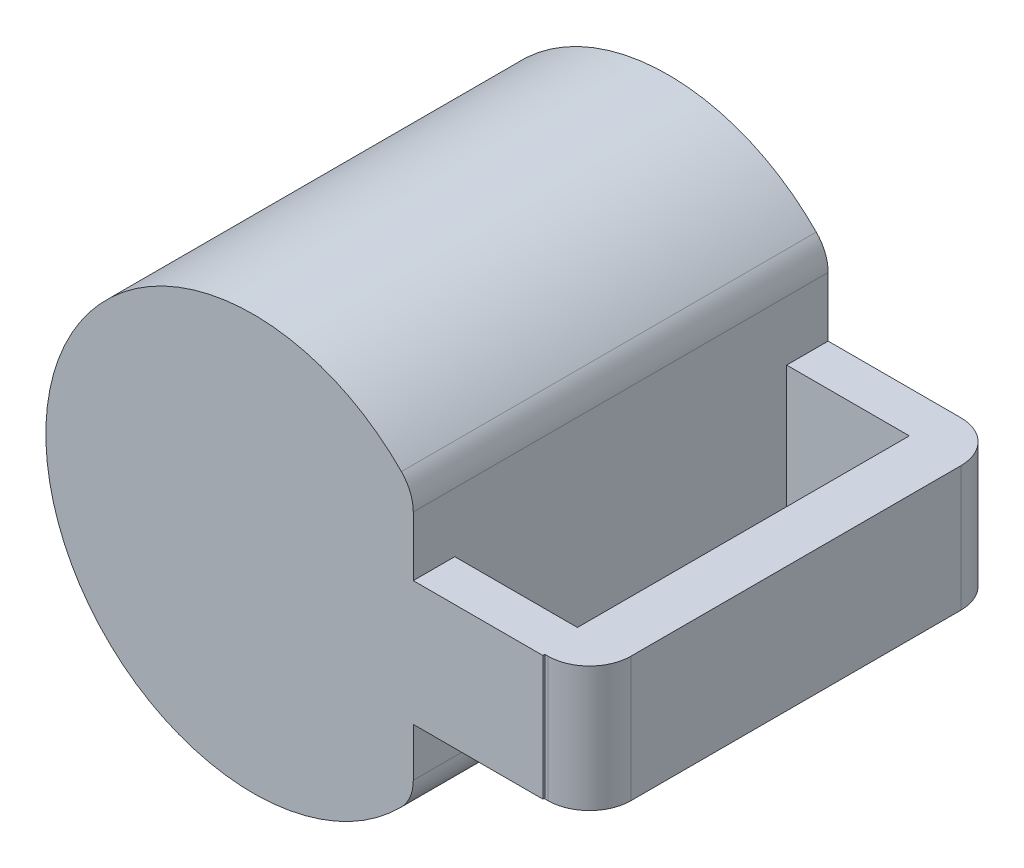
ISO-10303-21;
HEADER;
FILE_DESCRIPTION(('STEP AP214'),'2;1');
FILE_NAME('part.step','',(''),(''),'','','');
FILE_SCHEMA(('AUTOMOTIVE_DESIGN { 1 0 10303 214 1 1 1 1 }'));
ENDSEC;
DATA;
#1=APPLICATION_CONTEXT('core data for automotive mechanical design processes');
#2=APPLICATION_PROTOCOL_DEFINITION('international standard','automotive_design',2000,#1);
#3=PRODUCT_CONTEXT('',#1,'mechanical');
#4=PRODUCT('Part','Part','',(#3));
#5=PRODUCT_RELATED_PRODUCT_CATEGORY('part','',(#4));
#6=PRODUCT_DEFINITION_FORMATION('','',#4);
#7=PRODUCT_DEFINITION_CONTEXT('part definition',#1,'design');
#8=PRODUCT_DEFINITION('design','',#6,#7);
#9=PRODUCT_DEFINITION_SHAPE('','',#8);
#10=(LENGTH_UNIT() NAMED_UNIT(*) SI_UNIT(.MILLI.,.METRE.));
#11=(NAMED_UNIT(*) PLANE_ANGLE_UNIT() SI_UNIT($,.RADIAN.));
#12=(NAMED_UNIT(*) SI_UNIT($,.STERADIAN.) SOLID_ANGLE_UNIT());
#13=UNCERTAINTY_MEASURE_WITH_UNIT(LENGTH_MEASURE(1.E-05),#10,'distance_accuracy_value','');
#14=(GEOMETRIC_REPRESENTATION_CONTEXT(3) GLOBAL_UNCERTAINTY_ASSIGNED_CONTEXT((#13)) GLOBAL_UNIT_ASSIGNED_CONTEXT((#10,
#11,#12)) REPRESENTATION_CONTEXT('',''));
#15=CARTESIAN_POINT('',(0.,0.,0.));
#16=DIRECTION('',(0.,0.,1.));
#17=DIRECTION('',(1.,0.,0.));
#18=AXIS2_PLACEMENT_3D('',#15,#16,#17);
#19=CARTESIAN_POINT('',(-71.355365605137,5.73254638357682,10.));
#20=DIRECTION('',(-1.,0.,0.));
#21=DIRECTION('',(0.,0.,1.));
#22=AXIS2_PLACEMENT_3D('',#19,#20,#21);
#23=PLANE('',#22);
#24=DIRECTION('',(0.,1.,0.));
#25=VECTOR('',#24,1.);
#26=CARTESIAN_POINT('',(-71.355365605137,5.73254638357682,10.));
#27=LINE('',#26,#25);
#28=CARTESIAN_POINT('',(-71.355365605137,-0.250230693947041,10.));
#29=VERTEX_POINT('',#28);
#30=CARTESIAN_POINT('',(-71.355365605137,0.917510407191457,10.));
#31=VERTEX_POINT('',#30);
#32=EDGE_CURVE('E243',#29,#31,#27,.T.);
#33=ORIENTED_EDGE('',*,*,#32,.F.);
#34=DIRECTION('',(0.,0.,-1.));
#35=VECTOR('',#34,1.);
#36=CARTESIAN_POINT('',(-71.355365605137,-0.250230693947043,10.));
#37=LINE('',#36,#35);
#38=CARTESIAN_POINT('',(-71.355365605137,-0.250230693947041,0.));
#39=VERTEX_POINT('',#38);
#40=EDGE_CURVE('E284',#29,#39,#37,.T.);
#41=ORIENTED_EDGE('',*,*,#40,.T.);
#42=DIRECTION('',(0.,1.,0.));
#43=VECTOR('',#42,1.);
#44=CARTESIAN_POINT('',(-71.355365605137,5.73254638357682,0.));
#45=LINE('',#44,#43);
#46=CARTESIAN_POINT('',(-71.355365605137,0.917510407191457,0.));
#47=VERTEX_POINT('',#46);
#48=EDGE_CURVE('E247',#39,#47,#45,.T.);
#49=ORIENTED_EDGE('',*,*,#48,.T.);
#50=DIRECTION('',(0.,0.,-1.));
#51=VECTOR('',#50,1.);
#52=CARTESIAN_POINT('',(-71.355365605137,0.917510407191457,0.));
#53=LINE('',#52,#51);
#54=CARTESIAN_POINT('',(-71.355365605137,0.917510407191458,0.999999999999999));
#55=VERTEX_POINT('',#54);
#56=EDGE_CURVE('E204',#55,#47,#53,.T.);
#57=ORIENTED_EDGE('',*,*,#56,.F.);
#58=DIRECTION('',(0.,-1.,0.));
#59=VECTOR('',#58,1.);
#60=CARTESIAN_POINT('',(-71.355365605137,3.91751040719146,1.));
#61=LINE('',#60,#59);
#62=CARTESIAN_POINT('',(-71.355365605137,3.91751040719146,0.999999999999999));
#63=VERTEX_POINT('',#62);
#64=EDGE_CURVE('E201',#63,#55,#61,.T.);
#65=ORIENTED_EDGE('',*,*,#64,.F.);
#66=DIRECTION('',(0.,0.,1.));
#67=VECTOR('',#66,1.);
#68=CARTESIAN_POINT('',(-71.355365605137,3.91751040719146,0.));
#69=LINE('',#68,#67);
#70=CARTESIAN_POINT('',(-71.355365605137,3.91751040719146,0.));
#71=VERTEX_POINT('',#70);
#72=EDGE_CURVE('E198',#71,#63,#69,.T.);
#73=ORIENTED_EDGE('',*,*,#72,.F.);
#74=CARTESIAN_POINT('',(-71.355365605137,5.35023069394706,0.));
#75=VERTEX_POINT('',#74);
#76=EDGE_CURVE('E236',#71,#75,#45,.T.);
#77=ORIENTED_EDGE('',*,*,#76,.T.);
#78=DIRECTION('',(0.,0.,-1.));
#79=VECTOR('',#78,1.);
#80=CARTESIAN_POINT('',(-71.355365605137,5.35023069394706,10.));
#81=LINE('',#80,#79);
#82=CARTESIAN_POINT('',(-71.355365605137,5.35023069394706,10.));
#83=VERTEX_POINT('',#82);
#84=EDGE_CURVE('E280',#75,#83,#81,.F.);
#85=ORIENTED_EDGE('',*,*,#84,.T.);
#86=CARTESIAN_POINT('',(-71.355365605137,3.91751040719146,10.));
#87=VERTEX_POINT('',#86);
#88=EDGE_CURVE('E246',#87,#83,#27,.T.);
#89=ORIENTED_EDGE('',*,*,#88,.F.);
#90=DIRECTION('',(0.,0.,-1.));
#91=VECTOR('',#90,1.);
#92=CARTESIAN_POINT('',(-71.355365605137,3.91751040719146,10.));
#93=LINE('',#92,#91);
#94=CARTESIAN_POINT('',(-71.355365605137,3.91751040719146,9.));
#95=VERTEX_POINT('',#94);
#96=EDGE_CURVE('E216',#87,#95,#93,.T.);
#97=ORIENTED_EDGE('',*,*,#96,.T.);
#98=DIRECTION('',(0.,-1.,0.));
#99=VECTOR('',#98,1.);
#100=CARTESIAN_POINT('',(-71.355365605137,3.91751040719146,9.));
#101=LINE('',#100,#99);
#102=CARTESIAN_POINT('',(-71.355365605137,0.917510407191457,9.));
#103=VERTEX_POINT('',#102);
#104=EDGE_CURVE('E229',#95,#103,#101,.T.);
#105=ORIENTED_EDGE('',*,*,#104,.T.);
#106=DIRECTION('',(0.,0.,-1.));
#107=VECTOR('',#106,1.);
#108=CARTESIAN_POINT('',(-71.355365605137,0.917510407191457,10.));
#109=LINE('',#108,#107);
#110=EDGE_CURVE('E221',#31,#103,#109,.T.);
#111=ORIENTED_EDGE('',*,*,#110,.F.);
#112=EDGE_LOOP('',(#33,#41,#49,#57,#65,#73,#77,#85,#89,#97,#105,#111));
#113=FACE_BOUND('',#112,.T.);
#114=ADVANCED_FACE('F33',(#113),#23,.F.);
#115=CARTESIAN_POINT('',(-75.2117108329897,2.55000000000001,0.));
#116=DIRECTION('',(0.,0.,1.));
#117=DIRECTION('',(1.,0.,0.));
#118=AXIS2_PLACEMENT_3D('',#115,#116,#117);
#119=PLANE('',#118);
#120=ORIENTED_EDGE('',*,*,#48,.F.);
#121=CARTESIAN_POINT('',(-72.355365605137,-0.250230693947042,0.));
#122=DIRECTION('',(0.,0.,1.));
#123=DIRECTION('',(1.,0.,0.));
#124=AXIS2_PLACEMENT_3D('',#121,#122,#123);
#125=CIRCLE('',#124,1.);
#126=CARTESIAN_POINT('',(-71.6412792981738,-0.95028836743381,0.));
#127=VERTEX_POINT('',#126);
#128=EDGE_CURVE('E55',#39,#127,#125,.F.);
#129=ORIENTED_EDGE('',*,*,#128,.T.);
#130=CARTESIAN_POINT('',(-75.2117108329897,2.55000000000001,0.));
#131=DIRECTION('',(0.,0.,1.));
#132=DIRECTION('',(1.,0.,0.));
#133=AXIS2_PLACEMENT_3D('',#130,#131,#132);
#134=CIRCLE('',#133,5.);
#135=CARTESIAN_POINT('',(-71.6412792981738,6.05028836743383,0.));
#136=VERTEX_POINT('',#135);
#137=EDGE_CURVE('E245',#136,#127,#134,.T.);
#138=ORIENTED_EDGE('',*,*,#137,.F.);
#139=CARTESIAN_POINT('',(-72.355365605137,5.35023069394706,0.));
#140=DIRECTION('',(0.,0.,1.));
#141=DIRECTION('',(1.,0.,0.));
#142=AXIS2_PLACEMENT_3D('',#139,#140,#141);
#143=CIRCLE('',#142,1.);
#144=EDGE_CURVE('E278',#136,#75,#143,.F.);
#145=ORIENTED_EDGE('',*,*,#144,.T.);
#146=ORIENTED_EDGE('',*,*,#76,.F.);
#147=DIRECTION('',(-1.,0.,0.));
#148=VECTOR('',#147,1.);
#149=CARTESIAN_POINT('',(-67.355365605137,3.91751040719146,0.));
#150=LINE('',#149,#148);
#151=CARTESIAN_POINT('',(-68.155365605137,3.91751040719146,0.));
#152=VERTEX_POINT('',#151);
#153=EDGE_CURVE('E214',#152,#71,#150,.T.);
#154=ORIENTED_EDGE('',*,*,#153,.F.);
#155=DIRECTION('',(0.,1.,0.));
#156=VECTOR('',#155,1.);
#157=CARTESIAN_POINT('',(-68.155365605137,2.55000000000001,0.));
#158=LINE('',#157,#156);
#159=CARTESIAN_POINT('',(-68.155365605137,0.900046076850458,0.));
#160=VERTEX_POINT('',#159);
#161=EDGE_CURVE('E262',#152,#160,#158,.F.);
#162=ORIENTED_EDGE('',*,*,#161,.T.);
#163=DIRECTION('',(1.,0.,0.));
#164=VECTOR('',#163,1.);
#165=CARTESIAN_POINT('',(-68.3989979917468,0.900046076850458,0.));
#166=LINE('',#165,#164);
#167=CARTESIAN_POINT('',(-68.3989979917468,0.900046076850458,0.));
#168=VERTEX_POINT('',#167);
#169=EDGE_CURVE('E177',#168,#160,#166,.T.);
#170=ORIENTED_EDGE('',*,*,#169,.F.);
#171=DIRECTION('',(0.,1.,0.));
#172=VECTOR('',#171,1.);
#173=CARTESIAN_POINT('',(-68.3989979917468,3.91751040719146,0.));
#174=LINE('',#173,#172);
#175=CARTESIAN_POINT('',(-68.3989979917468,0.917510407191457,0.));
#176=VERTEX_POINT('',#175);
#177=EDGE_CURVE('E184',#168,#176,#174,.T.);
#178=ORIENTED_EDGE('',*,*,#177,.T.);
#179=DIRECTION('',(-1.,0.,0.));
#180=VECTOR('',#179,1.);
#181=CARTESIAN_POINT('',(-67.355365605137,0.917510407191457,0.));
#182=LINE('',#181,#180);
#183=EDGE_CURVE('E207',#176,#47,#182,.T.);
#184=ORIENTED_EDGE('',*,*,#183,.T.);
#185=EDGE_LOOP('',(#120,#129,#138,#145,#146,#154,#162,#170,#178,#184));
#186=FACE_BOUND('',#185,.T.);
#187=ADVANCED_FACE('F294',(#186),#119,.F.);
#188=CARTESIAN_POINT('',(-75.2117108329897,2.55000000000001,10.));
#189=DIRECTION('',(0.,0.,1.));
#190=DIRECTION('',(1.,0.,0.));
#191=AXIS2_PLACEMENT_3D('',#188,#189,#190);
#192=PLANE('',#191);
#193=CARTESIAN_POINT('',(-75.2117108329897,2.55000000000001,10.));
#194=DIRECTION('',(0.,0.,1.));
#195=DIRECTION('',(1.,0.,0.));
#196=AXIS2_PLACEMENT_3D('',#193,#194,#195);
#197=CIRCLE('',#196,5.);
#198=CARTESIAN_POINT('',(-71.6412792981738,6.05028836743383,10.));
#199=VERTEX_POINT('',#198);
#200=CARTESIAN_POINT('',(-71.6412792981738,-0.95028836743381,10.));
#201=VERTEX_POINT('',#200);
#202=EDGE_CURVE('E249',#199,#201,#197,.T.);
#203=ORIENTED_EDGE('',*,*,#202,.T.);
#204=CARTESIAN_POINT('',(-72.355365605137,-0.250230693947042,10.));
#205=DIRECTION('',(0.,0.,1.));
#206=DIRECTION('',(1.,0.,0.));
#207=AXIS2_PLACEMENT_3D('',#204,#205,#206);
#208=CIRCLE('',#207,1.);
#209=EDGE_CURVE('E11',#201,#29,#208,.T.);
#210=ORIENTED_EDGE('',*,*,#209,.T.);
#211=ORIENTED_EDGE('',*,*,#32,.T.);
#212=DIRECTION('',(-1.,0.,0.));
#213=VECTOR('',#212,1.);
#214=CARTESIAN_POINT('',(-68.2333225323549,0.917510407191457,10.));
#215=LINE('',#214,#213);
#216=CARTESIAN_POINT('',(-68.2333225323549,0.917510407191457,10.));
#217=VERTEX_POINT('',#216);
#218=EDGE_CURVE('E237',#217,#31,#215,.T.);
#219=ORIENTED_EDGE('',*,*,#218,.F.);
#220=DIRECTION('',(0.,-1.,0.));
#221=VECTOR('',#220,1.);
#222=CARTESIAN_POINT('',(-68.2333225323549,3.91751040719146,10.));
#223=LINE('',#222,#221);
#224=CARTESIAN_POINT('',(-68.2333225323549,3.91751040719146,10.));
#225=VERTEX_POINT('',#224);
#226=EDGE_CURVE('E224',#225,#217,#223,.T.);
#227=ORIENTED_EDGE('',*,*,#226,.F.);
#228=DIRECTION('',(-1.,0.,0.));
#229=VECTOR('',#228,1.);
#230=CARTESIAN_POINT('',(-68.2333225323549,3.91751040719146,10.));
#231=LINE('',#230,#229);
#232=EDGE_CURVE('E234',#225,#87,#231,.T.);
#233=ORIENTED_EDGE('',*,*,#232,.T.);
#234=ORIENTED_EDGE('',*,*,#88,.T.);
#235=CARTESIAN_POINT('',(-72.355365605137,5.35023069394706,10.));
#236=DIRECTION('',(0.,0.,1.));
#237=DIRECTION('',(1.,0.,0.));
#238=AXIS2_PLACEMENT_3D('',#235,#236,#237);
#239=CIRCLE('',#238,1.);
#240=EDGE_CURVE('E282',#83,#199,#239,.T.);
#241=ORIENTED_EDGE('',*,*,#240,.T.);
#242=EDGE_LOOP('',(#203,#210,#211,#219,#227,#233,#234,#241));
#243=FACE_BOUND('',#242,.T.);
#244=ADVANCED_FACE('F343',(#243),#192,.T.);
#245=CARTESIAN_POINT('',(-75.2117108329897,2.55000000000001,10.));
#246=DIRECTION('',(0.,0.,-1.));
#247=DIRECTION('',(-1.,0.,0.));
#248=AXIS2_PLACEMENT_3D('',#245,#246,#247);
#249=CYLINDRICAL_SURFACE('',#248,5.);
#250=ORIENTED_EDGE('',*,*,#137,.T.);
#251=DIRECTION('',(0.,0.,-1.));
#252=VECTOR('',#251,1.);
#253=CARTESIAN_POINT('',(-71.6412792981738,-0.950288367433808,10.));
#254=LINE('',#253,#252);
#255=EDGE_CURVE('E41',#127,#201,#254,.F.);
#256=ORIENTED_EDGE('',*,*,#255,.T.);
#257=ORIENTED_EDGE('',*,*,#202,.F.);
#258=DIRECTION('',(0.,0.,-1.));
#259=VECTOR('',#258,1.);
#260=CARTESIAN_POINT('',(-71.6412792981738,6.05028836743383,10.));
#261=LINE('',#260,#259);
#262=EDGE_CURVE('E275',#199,#136,#261,.T.);
#263=ORIENTED_EDGE('',*,*,#262,.T.);
#264=EDGE_LOOP('',(#250,#256,#257,#263));
#265=FACE_BOUND('',#264,.T.);
#266=ADVANCED_FACE('F347',(#265),#249,.T.);
#267=CARTESIAN_POINT('',(-68.2333225323549,3.91751040719146,10.));
#268=DIRECTION('',(0.,1.,0.));
#269=DIRECTION('',(0.,0.,1.));
#270=AXIS2_PLACEMENT_3D('',#267,#268,#269);
#271=PLANE('',#270);
#272=DIRECTION('',(1.,0.,0.));
#273=VECTOR('',#272,1.);
#274=CARTESIAN_POINT('',(-68.3989979917468,3.91751040719146,9.95229496669842));
#275=LINE('',#274,#273);
#276=CARTESIAN_POINT('',(-68.2333225323549,3.91751040719146,9.95229496669842));
#277=VERTEX_POINT('',#276);
#278=CARTESIAN_POINT('',(-68.155365605137,3.91751040719146,9.95229496669842));
#279=VERTEX_POINT('',#278);
#280=EDGE_CURVE('E178',#277,#279,#275,.T.);
#281=ORIENTED_EDGE('',*,*,#280,.T.);
#282=CARTESIAN_POINT('',(-68.155365605137,3.91751040719146,8.95229496669842));
#283=DIRECTION('',(0.,1.,0.));
#284=DIRECTION('',(0.,0.,1.));
#285=AXIS2_PLACEMENT_3D('',#282,#283,#284);
#286=CIRCLE('',#285,1.);
#287=CARTESIAN_POINT('',(-67.155365605137,3.91751040719146,8.95229496669842));
#288=VERTEX_POINT('',#287);
#289=EDGE_CURVE('E273',#279,#288,#286,.T.);
#290=ORIENTED_EDGE('',*,*,#289,.T.);
#291=DIRECTION('',(0.,0.,1.));
#292=VECTOR('',#291,1.);
#293=CARTESIAN_POINT('',(-67.155365605137,3.91751040719146,0.));
#294=LINE('',#293,#292);
#295=CARTESIAN_POINT('',(-67.155365605137,3.91751040719146,1.));
#296=VERTEX_POINT('',#295);
#297=EDGE_CURVE('E314',#296,#288,#294,.T.);
#298=ORIENTED_EDGE('',*,*,#297,.F.);
#299=CARTESIAN_POINT('',(-68.155365605137,3.91751040719146,1.));
#300=DIRECTION('',(0.,1.,0.));
#301=DIRECTION('',(0.,0.,1.));
#302=AXIS2_PLACEMENT_3D('',#299,#300,#301);
#303=CIRCLE('',#302,1.);
#304=EDGE_CURVE('E260',#296,#152,#303,.T.);
#305=ORIENTED_EDGE('',*,*,#304,.T.);
#306=ORIENTED_EDGE('',*,*,#153,.T.);
#307=ORIENTED_EDGE('',*,*,#72,.T.);
#308=DIRECTION('',(-1.,0.,0.));
#309=VECTOR('',#308,1.);
#310=CARTESIAN_POINT('',(-67.355365605137,3.91751040719146,1.));
#311=LINE('',#310,#309);
#312=CARTESIAN_POINT('',(-68.3989979917468,3.91751040719146,1.));
#313=VERTEX_POINT('',#312);
#314=EDGE_CURVE('E212',#313,#63,#311,.T.);
#315=ORIENTED_EDGE('',*,*,#314,.F.);
#316=DIRECTION('',(0.,0.,1.));
#317=VECTOR('',#316,1.);
#318=CARTESIAN_POINT('',(-68.3989979917468,3.91751040719146,0.));
#319=LINE('',#318,#317);
#320=CARTESIAN_POINT('',(-68.3989979917468,3.91751040719146,9.));
#321=VERTEX_POINT('',#320);
#322=EDGE_CURVE('E169',#313,#321,#319,.T.);
#323=ORIENTED_EDGE('',*,*,#322,.T.);
#324=DIRECTION('',(-1.,0.,0.));
#325=VECTOR('',#324,1.);
#326=CARTESIAN_POINT('',(-68.2333225323549,3.91751040719146,9.));
#327=LINE('',#326,#325);
#328=EDGE_CURVE('E226',#321,#95,#327,.T.);
#329=ORIENTED_EDGE('',*,*,#328,.T.);
#330=ORIENTED_EDGE('',*,*,#96,.F.);
#331=ORIENTED_EDGE('',*,*,#232,.F.);
#332=DIRECTION('',(0.,0.,-1.));
#333=VECTOR('',#332,1.);
#334=CARTESIAN_POINT('',(-68.2333225323549,3.91751040719146,10.));
#335=LINE('',#334,#333);
#336=EDGE_CURVE('E217',#225,#277,#335,.T.);
#337=ORIENTED_EDGE('',*,*,#336,.T.);
#338=EDGE_LOOP('',(#281,#290,#298,#305,#306,#307,#315,#323,#329,#330,#331,#337));
#339=FACE_BOUND('',#338,.T.);
#340=ADVANCED_FACE('F307',(#339),#271,.T.);
#341=CARTESIAN_POINT('',(-68.2333225323549,0.917510407191457,10.));
#342=DIRECTION('',(0.,1.,0.));
#343=DIRECTION('',(0.,0.,1.));
#344=AXIS2_PLACEMENT_3D('',#341,#342,#343);
#345=PLANE('',#344);
#346=DIRECTION('',(0.,0.,1.));
#347=VECTOR('',#346,1.);
#348=CARTESIAN_POINT('',(-68.3989979917468,0.917510407191457,10.));
#349=LINE('',#348,#347);
#350=CARTESIAN_POINT('',(-68.3989979917468,0.917510407191457,9.));
#351=VERTEX_POINT('',#350);
#352=CARTESIAN_POINT('',(-68.3989979917468,0.917510407191457,9.95229496669842));
#353=VERTEX_POINT('',#352);
#354=EDGE_CURVE('E195',#351,#353,#349,.T.);
#355=ORIENTED_EDGE('',*,*,#354,.T.);
#356=DIRECTION('',(1.,0.,0.));
#357=VECTOR('',#356,1.);
#358=CARTESIAN_POINT('',(-68.2333225323549,0.917510407191457,9.95229496669842));
#359=LINE('',#358,#357);
#360=CARTESIAN_POINT('',(-68.2333225323549,0.917510407191457,9.95229496669842));
#361=VERTEX_POINT('',#360);
#362=EDGE_CURVE('E164',#353,#361,#359,.T.);
#363=ORIENTED_EDGE('',*,*,#362,.T.);
#364=DIRECTION('',(0.,0.,-1.));
#365=VECTOR('',#364,1.);
#366=CARTESIAN_POINT('',(-68.2333225323549,0.917510407191457,10.));
#367=LINE('',#366,#365);
#368=EDGE_CURVE('E220',#217,#361,#367,.T.);
#369=ORIENTED_EDGE('',*,*,#368,.F.);
#370=ORIENTED_EDGE('',*,*,#218,.T.);
#371=ORIENTED_EDGE('',*,*,#110,.T.);
#372=DIRECTION('',(-1.,0.,0.));
#373=VECTOR('',#372,1.);
#374=CARTESIAN_POINT('',(-68.2333225323549,0.917510407191457,9.));
#375=LINE('',#374,#373);
#376=EDGE_CURVE('E240',#351,#103,#375,.T.);
#377=ORIENTED_EDGE('',*,*,#376,.F.);
#378=EDGE_LOOP('',(#355,#363,#369,#370,#371,#377));
#379=FACE_BOUND('',#378,.T.);
#380=ADVANCED_FACE('F332',(#379),#345,.F.);
#381=CARTESIAN_POINT('',(-68.2333225323549,3.91751040719146,9.));
#382=DIRECTION('',(0.,0.,-1.));
#383=DIRECTION('',(-1.,0.,0.));
#384=AXIS2_PLACEMENT_3D('',#381,#382,#383);
#385=PLANE('',#384);
#386=DIRECTION('',(0.,1.,0.));
#387=VECTOR('',#386,1.);
#388=CARTESIAN_POINT('',(-68.3989979917468,3.91751040719146,9.));
#389=LINE('',#388,#387);
#390=EDGE_CURVE('E193',#351,#321,#389,.T.);
#391=ORIENTED_EDGE('',*,*,#390,.F.);
#392=ORIENTED_EDGE('',*,*,#376,.T.);
#393=ORIENTED_EDGE('',*,*,#104,.F.);
#394=ORIENTED_EDGE('',*,*,#328,.F.);
#395=EDGE_LOOP('',(#391,#392,#393,#394));
#396=FACE_BOUND('',#395,.T.);
#397=ADVANCED_FACE('F335',(#396),#385,.T.);
#398=CARTESIAN_POINT('',(-68.2333225323549,0.,0.));
#399=DIRECTION('',(-1.,0.,0.));
#400=DIRECTION('',(0.,0.,1.));
#401=AXIS2_PLACEMENT_3D('',#398,#399,#400);
#402=PLANE('',#401);
#403=ORIENTED_EDGE('',*,*,#368,.T.);
#404=DIRECTION('',(0.,1.,0.));
#405=VECTOR('',#404,1.);
#406=CARTESIAN_POINT('',(-68.2333225323549,0.,9.95229496669842));
#407=LINE('',#406,#405);
#408=EDGE_CURVE('E254',#361,#277,#407,.T.);
#409=ORIENTED_EDGE('',*,*,#408,.T.);
#410=ORIENTED_EDGE('',*,*,#336,.F.);
#411=ORIENTED_EDGE('',*,*,#226,.T.);
#412=EDGE_LOOP('',(#403,#409,#410,#411));
#413=FACE_BOUND('',#412,.T.);
#414=ADVANCED_FACE('F328',(#413),#402,.F.);
#415=CARTESIAN_POINT('',(-67.355365605137,3.91751040719146,1.));
#416=DIRECTION('',(0.,0.,-1.));
#417=DIRECTION('',(0.,1.,0.));
#418=AXIS2_PLACEMENT_3D('',#415,#416,#417);
#419=PLANE('',#418);
#420=DIRECTION('',(-1.,0.,0.));
#421=VECTOR('',#420,1.);
#422=CARTESIAN_POINT('',(-67.355365605137,0.917510407191457,1.));
#423=LINE('',#422,#421);
#424=CARTESIAN_POINT('',(-68.3989979917468,0.917510407191457,1.));
#425=VERTEX_POINT('',#424);
#426=EDGE_CURVE('E210',#425,#55,#423,.T.);
#427=ORIENTED_EDGE('',*,*,#426,.F.);
#428=DIRECTION('',(0.,1.,0.));
#429=VECTOR('',#428,1.);
#430=CARTESIAN_POINT('',(-68.3989979917468,3.91751040719146,1.));
#431=LINE('',#430,#429);
#432=EDGE_CURVE('E190',#425,#313,#431,.T.);
#433=ORIENTED_EDGE('',*,*,#432,.T.);
#434=ORIENTED_EDGE('',*,*,#314,.T.);
#435=ORIENTED_EDGE('',*,*,#64,.T.);
#436=EDGE_LOOP('',(#427,#433,#434,#435));
#437=FACE_BOUND('',#436,.T.);
#438=ADVANCED_FACE('F301',(#437),#419,.F.);
#439=CARTESIAN_POINT('',(-67.355365605137,0.917510407191457,0.));
#440=DIRECTION('',(0.,1.,0.));
#441=DIRECTION('',(0.,0.,1.));
#442=AXIS2_PLACEMENT_3D('',#439,#440,#441);
#443=PLANE('',#442);
#444=ORIENTED_EDGE('',*,*,#183,.F.);
#445=DIRECTION('',(0.,0.,1.));
#446=VECTOR('',#445,1.);
#447=CARTESIAN_POINT('',(-68.3989979917468,0.917510407191457,0.));
#448=LINE('',#447,#446);
#449=EDGE_CURVE('E251',#176,#425,#448,.T.);
#450=ORIENTED_EDGE('',*,*,#449,.T.);
#451=ORIENTED_EDGE('',*,*,#426,.T.);
#452=ORIENTED_EDGE('',*,*,#56,.T.);
#453=EDGE_LOOP('',(#444,#450,#451,#452));
#454=FACE_BOUND('',#453,.T.);
#455=ADVANCED_FACE('F296',(#454),#443,.F.);
#456=CARTESIAN_POINT('',(-68.3989979917468,3.91751040719146,9.95229496669842));
#457=DIRECTION('',(0.,0.,1.));
#458=DIRECTION('',(1.,0.,0.));
#459=AXIS2_PLACEMENT_3D('',#456,#457,#458);
#460=PLANE('',#459);
#461=DIRECTION('',(1.,0.,0.));
#462=VECTOR('',#461,1.);
#463=CARTESIAN_POINT('',(-68.3989979917468,0.900046076850458,9.95229496669842));
#464=LINE('',#463,#462);
#465=CARTESIAN_POINT('',(-68.3989979917468,0.900046076850458,9.95229496669842));
#466=VERTEX_POINT('',#465);
#467=CARTESIAN_POINT('',(-68.155365605137,0.900046076850458,9.95229496669842));
#468=VERTEX_POINT('',#467);
#469=EDGE_CURVE('E161',#466,#468,#464,.T.);
#470=ORIENTED_EDGE('',*,*,#469,.T.);
#471=DIRECTION('',(0.,-1.,0.));
#472=VECTOR('',#471,1.);
#473=CARTESIAN_POINT('',(-68.155365605137,3.91751040719146,9.95229496669842));
#474=LINE('',#473,#472);
#475=EDGE_CURVE('E271',#468,#279,#474,.F.);
#476=ORIENTED_EDGE('',*,*,#475,.T.);
#477=ORIENTED_EDGE('',*,*,#280,.F.);
#478=ORIENTED_EDGE('',*,*,#408,.F.);
#479=ORIENTED_EDGE('',*,*,#362,.F.);
#480=DIRECTION('',(0.,-1.,0.));
#481=VECTOR('',#480,1.);
#482=CARTESIAN_POINT('',(-68.3989979917468,3.91751040719146,9.95229496669842));
#483=LINE('',#482,#481);
#484=EDGE_CURVE('E158',#353,#466,#483,.T.);
#485=ORIENTED_EDGE('',*,*,#484,.T.);
#486=EDGE_LOOP('',(#470,#476,#477,#478,#479,#485));
#487=FACE_BOUND('',#486,.T.);
#488=ADVANCED_FACE('F160',(#487),#460,.T.);
#489=CARTESIAN_POINT('',(-68.3989979917468,0.,0.));
#490=DIRECTION('',(-1.,0.,0.));
#491=DIRECTION('',(0.,0.,1.));
#492=AXIS2_PLACEMENT_3D('',#489,#490,#491);
#493=PLANE('',#492);
#494=ORIENTED_EDGE('',*,*,#354,.F.);
#495=ORIENTED_EDGE('',*,*,#390,.T.);
#496=ORIENTED_EDGE('',*,*,#322,.F.);
#497=ORIENTED_EDGE('',*,*,#432,.F.);
#498=ORIENTED_EDGE('',*,*,#449,.F.);
#499=ORIENTED_EDGE('',*,*,#177,.F.);
#500=DIRECTION('',(0.,0.,-1.));
#501=VECTOR('',#500,1.);
#502=CARTESIAN_POINT('',(-68.3989979917468,0.900046076850458,0.));
#503=LINE('',#502,#501);
#504=EDGE_CURVE('E168',#466,#168,#503,.T.);
#505=ORIENTED_EDGE('',*,*,#504,.F.);
#506=ORIENTED_EDGE('',*,*,#484,.F.);
#507=EDGE_LOOP('',(#494,#495,#496,#497,#498,#499,#505,#506));
#508=FACE_BOUND('',#507,.T.);
#509=ADVANCED_FACE('F181',(#508),#493,.T.);
#510=CARTESIAN_POINT('',(-68.3989979917468,0.900046076850458,0.));
#511=DIRECTION('',(0.,-1.,0.));
#512=DIRECTION('',(0.,0.,-1.));
#513=AXIS2_PLACEMENT_3D('',#510,#511,#512);
#514=PLANE('',#513);
#515=DIRECTION('',(0.,0.,-1.));
#516=VECTOR('',#515,1.);
#517=CARTESIAN_POINT('',(-67.155365605137,0.900046076850458,0.));
#518=LINE('',#517,#516);
#519=CARTESIAN_POINT('',(-67.155365605137,0.900046076850458,8.95229496669842));
#520=VERTEX_POINT('',#519);
#521=CARTESIAN_POINT('',(-67.155365605137,0.900046076850458,1.));
#522=VERTEX_POINT('',#521);
#523=EDGE_CURVE('E310',#520,#522,#518,.T.);
#524=ORIENTED_EDGE('',*,*,#523,.F.);
#525=CARTESIAN_POINT('',(-68.155365605137,0.900046076850458,8.95229496669842));
#526=DIRECTION('',(0.,-1.,0.));
#527=DIRECTION('',(0.,0.,-1.));
#528=AXIS2_PLACEMENT_3D('',#525,#526,#527);
#529=CIRCLE('',#528,1.);
#530=EDGE_CURVE('E176',#520,#468,#529,.T.);
#531=ORIENTED_EDGE('',*,*,#530,.T.);
#532=ORIENTED_EDGE('',*,*,#469,.F.);
#533=ORIENTED_EDGE('',*,*,#504,.T.);
#534=ORIENTED_EDGE('',*,*,#169,.T.);
#535=CARTESIAN_POINT('',(-68.155365605137,0.900046076850458,1.));
#536=DIRECTION('',(0.,-1.,0.));
#537=DIRECTION('',(0.,0.,-1.));
#538=AXIS2_PLACEMENT_3D('',#535,#536,#537);
#539=CIRCLE('',#538,1.);
#540=EDGE_CURVE('E264',#160,#522,#539,.T.);
#541=ORIENTED_EDGE('',*,*,#540,.T.);
#542=EDGE_LOOP('',(#524,#531,#532,#533,#534,#541));
#543=FACE_BOUND('',#542,.T.);
#544=ADVANCED_FACE('F174',(#543),#514,.T.);
#545=CARTESIAN_POINT('',(-67.155365605137,0.,0.));
#546=DIRECTION('',(-1.,0.,0.));
#547=DIRECTION('',(0.,0.,1.));
#548=AXIS2_PLACEMENT_3D('',#545,#546,#547);
#549=PLANE('',#548);
#550=ORIENTED_EDGE('',*,*,#297,.T.);
#551=DIRECTION('',(0.,-1.,0.));
#552=VECTOR('',#551,1.);
#553=CARTESIAN_POINT('',(-67.155365605137,0.900046076850458,8.95229496669842));
#554=LINE('',#553,#552);
#555=EDGE_CURVE('E267',#288,#520,#554,.T.);
#556=ORIENTED_EDGE('',*,*,#555,.T.);
#557=ORIENTED_EDGE('',*,*,#523,.T.);
#558=DIRECTION('',(0.,1.,0.));
#559=VECTOR('',#558,1.);
#560=CARTESIAN_POINT('',(-67.155365605137,0.,1.));
#561=LINE('',#560,#559);
#562=EDGE_CURVE('E257',#522,#296,#561,.T.);
#563=ORIENTED_EDGE('',*,*,#562,.T.);
#564=EDGE_LOOP('',(#550,#556,#557,#563));
#565=FACE_BOUND('',#564,.T.);
#566=ADVANCED_FACE('F319',(#565),#549,.F.);
#567=CARTESIAN_POINT('',(-68.155365605137,0.,1.));
#568=DIRECTION('',(0.,1.,0.));
#569=DIRECTION('',(0.,0.,1.));
#570=AXIS2_PLACEMENT_3D('',#567,#568,#569);
#571=CYLINDRICAL_SURFACE('',#570,1.);
#572=ORIENTED_EDGE('',*,*,#540,.F.);
#573=ORIENTED_EDGE('',*,*,#161,.F.);
#574=ORIENTED_EDGE('',*,*,#304,.F.);
#575=ORIENTED_EDGE('',*,*,#562,.F.);
#576=EDGE_LOOP('',(#572,#573,#574,#575));
#577=FACE_BOUND('',#576,.T.);
#578=ADVANCED_FACE('F353',(#577),#571,.T.);
#579=CARTESIAN_POINT('',(-68.155365605137,0.,8.95229496669842));
#580=DIRECTION('',(0.,1.,0.));
#581=DIRECTION('',(0.,0.,1.));
#582=AXIS2_PLACEMENT_3D('',#579,#580,#581);
#583=CYLINDRICAL_SURFACE('',#582,1.);
#584=ORIENTED_EDGE('',*,*,#289,.F.);
#585=ORIENTED_EDGE('',*,*,#475,.F.);
#586=ORIENTED_EDGE('',*,*,#530,.F.);
#587=ORIENTED_EDGE('',*,*,#555,.F.);
#588=EDGE_LOOP('',(#584,#585,#586,#587));
#589=FACE_BOUND('',#588,.T.);
#590=ADVANCED_FACE('F323',(#589),#583,.T.);
#591=CARTESIAN_POINT('',(-72.355365605137,5.35023069394706,10.));
#592=DIRECTION('',(0.,0.,-1.));
#593=DIRECTION('',(-1.,0.,0.));
#594=AXIS2_PLACEMENT_3D('',#591,#592,#593);
#595=CYLINDRICAL_SURFACE('',#594,1.);
#596=ORIENTED_EDGE('',*,*,#240,.F.);
#597=ORIENTED_EDGE('',*,*,#84,.F.);
#598=ORIENTED_EDGE('',*,*,#144,.F.);
#599=ORIENTED_EDGE('',*,*,#262,.F.);
#600=EDGE_LOOP('',(#596,#597,#598,#599));
#601=FACE_BOUND('',#600,.T.);
#602=ADVANCED_FACE('F346',(#601),#595,.T.);
#603=CARTESIAN_POINT('',(-72.355365605137,-0.250230693947042,10.));
#604=DIRECTION('',(0.,0.,-1.));
#605=DIRECTION('',(-1.,0.,0.));
#606=AXIS2_PLACEMENT_3D('',#603,#604,#605);
#607=CYLINDRICAL_SURFACE('',#606,1.);
#608=ORIENTED_EDGE('',*,*,#209,.F.);
#609=ORIENTED_EDGE('',*,*,#255,.F.);
#610=ORIENTED_EDGE('',*,*,#128,.F.);
#611=ORIENTED_EDGE('',*,*,#40,.F.);
#612=EDGE_LOOP('',(#608,#609,#610,#611));
#613=FACE_BOUND('',#612,.T.);
#614=ADVANCED_FACE('F35',(#613),#607,.T.);
#615=CLOSED_SHELL('',(#114,#187,#244,#266,#340,#380,#397,#414,#438,#455,#488,#509,#544,#566,
#578,#590,#602,#614));
#616=MANIFOLD_SOLID_BREP('B2',#615);
#617=ADVANCED_BREP_SHAPE_REPRESENTATION('',(#18,#616),#14);
#618=SHAPE_DEFINITION_REPRESENTATION(#9,#617);
ENDSEC;
END-ISO-10303-21;
